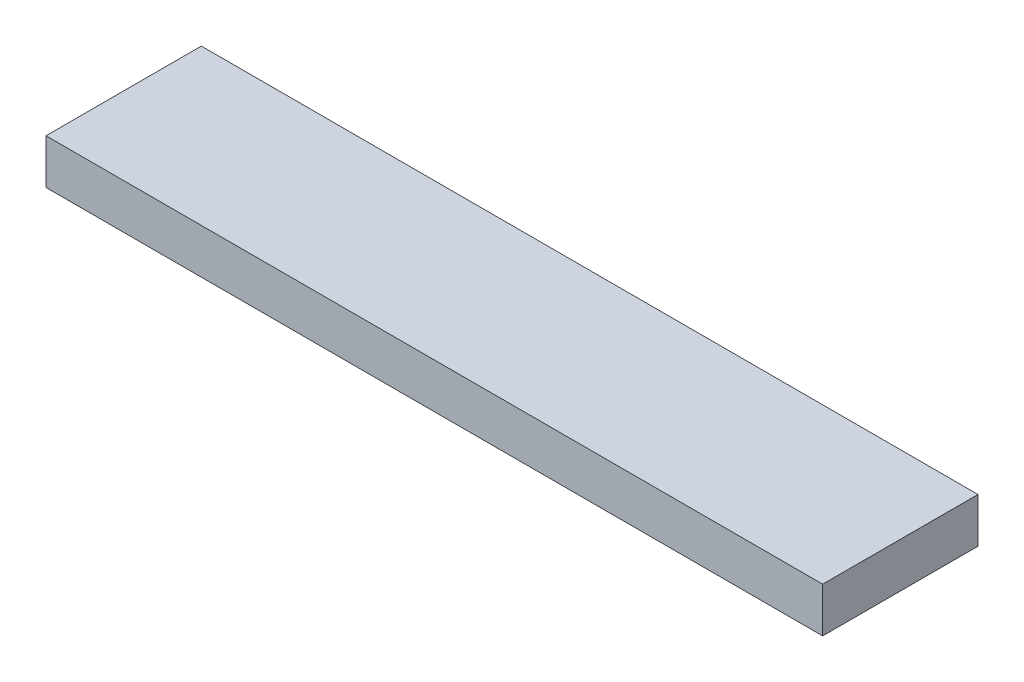
ISO-10303-21;
HEADER;
FILE_DESCRIPTION(('STEP AP214'),'2;1');
FILE_NAME('part.step','',(''),(''),'','','');
FILE_SCHEMA(('AUTOMOTIVE_DESIGN { 1 0 10303 214 1 1 1 1 }'));
ENDSEC;
DATA;
#1=APPLICATION_CONTEXT('core data for automotive mechanical design processes');
#2=APPLICATION_PROTOCOL_DEFINITION('international standard','automotive_design',2000,#1);
#3=PRODUCT_CONTEXT('',#1,'mechanical');
#4=PRODUCT('Part','Part','',(#3));
#5=PRODUCT_RELATED_PRODUCT_CATEGORY('part','',(#4));
#6=PRODUCT_DEFINITION_FORMATION('','',#4);
#7=PRODUCT_DEFINITION_CONTEXT('part definition',#1,'design');
#8=PRODUCT_DEFINITION('design','',#6,#7);
#9=PRODUCT_DEFINITION_SHAPE('','',#8);
#10=(LENGTH_UNIT() NAMED_UNIT(*) SI_UNIT(.MILLI.,.METRE.));
#11=(NAMED_UNIT(*) PLANE_ANGLE_UNIT() SI_UNIT($,.RADIAN.));
#12=(NAMED_UNIT(*) SI_UNIT($,.STERADIAN.) SOLID_ANGLE_UNIT());
#13=UNCERTAINTY_MEASURE_WITH_UNIT(LENGTH_MEASURE(1.E-05),#10,'distance_accuracy_value','');
#14=(GEOMETRIC_REPRESENTATION_CONTEXT(3) GLOBAL_UNCERTAINTY_ASSIGNED_CONTEXT((#13)) GLOBAL_UNIT_ASSIGNED_CONTEXT((#10,
#11,#12)) REPRESENTATION_CONTEXT('',''));
#15=CARTESIAN_POINT('',(0.,0.,0.));
#16=DIRECTION('',(0.,0.,1.));
#17=DIRECTION('',(1.,0.,0.));
#18=AXIS2_PLACEMENT_3D('',#15,#16,#17);
#19=CARTESIAN_POINT('',(-27.5,3.175,5.50000000000001));
#20=DIRECTION('',(1.,0.,0.));
#21=DIRECTION('',(0.,0.,-1.));
#22=AXIS2_PLACEMENT_3D('',#19,#20,#21);
#23=PLANE('',#22);
#24=DIRECTION('',(0.,0.,1.));
#25=VECTOR('',#24,1.);
#26=CARTESIAN_POINT('',(-27.5,0.,5.50000000000001));
#27=LINE('',#26,#25);
#28=CARTESIAN_POINT('',(-27.5,0.,-5.49999999999999));
#29=VERTEX_POINT('',#28);
#30=CARTESIAN_POINT('',(-27.5,0.,5.50000000000001));
#31=VERTEX_POINT('',#30);
#32=EDGE_CURVE('E95',#29,#31,#27,.T.);
#33=ORIENTED_EDGE('',*,*,#32,.T.);
#34=DIRECTION('',(0.,-1.,0.));
#35=VECTOR('',#34,1.);
#36=CARTESIAN_POINT('',(-27.5,3.175,5.50000000000001));
#37=LINE('',#36,#35);
#38=CARTESIAN_POINT('',(-27.5,3.175,5.50000000000001));
#39=VERTEX_POINT('',#38);
#40=EDGE_CURVE('E11',#39,#31,#37,.T.);
#41=ORIENTED_EDGE('',*,*,#40,.F.);
#42=DIRECTION('',(0.,0.,1.));
#43=VECTOR('',#42,1.);
#44=CARTESIAN_POINT('',(-27.5,3.175,5.50000000000001));
#45=LINE('',#44,#43);
#46=CARTESIAN_POINT('',(-27.5,3.175,-5.49999999999999));
#47=VERTEX_POINT('',#46);
#48=EDGE_CURVE('E83',#47,#39,#45,.T.);
#49=ORIENTED_EDGE('',*,*,#48,.F.);
#50=DIRECTION('',(0.,-1.,0.));
#51=VECTOR('',#50,1.);
#52=CARTESIAN_POINT('',(-27.5,3.175,-5.49999999999999));
#53=LINE('',#52,#51);
#54=EDGE_CURVE('E91',#47,#29,#53,.T.);
#55=ORIENTED_EDGE('',*,*,#54,.T.);
#56=EDGE_LOOP('',(#33,#41,#49,#55));
#57=FACE_BOUND('',#56,.T.);
#58=ADVANCED_FACE('F32',(#57),#23,.F.);
#59=CARTESIAN_POINT('',(27.5,3.175,5.5));
#60=DIRECTION('',(0.,0.,-1.));
#61=DIRECTION('',(-1.,0.,0.));
#62=AXIS2_PLACEMENT_3D('',#59,#60,#61);
#63=PLANE('',#62);
#64=DIRECTION('',(1.,0.,0.));
#65=VECTOR('',#64,1.);
#66=CARTESIAN_POINT('',(27.5,0.,5.5));
#67=LINE('',#66,#65);
#68=CARTESIAN_POINT('',(27.5,0.,5.5));
#69=VERTEX_POINT('',#68);
#70=EDGE_CURVE('E87',#31,#69,#67,.T.);
#71=ORIENTED_EDGE('',*,*,#70,.T.);
#72=DIRECTION('',(0.,-1.,0.));
#73=VECTOR('',#72,1.);
#74=CARTESIAN_POINT('',(27.5,3.175,5.5));
#75=LINE('',#74,#73);
#76=CARTESIAN_POINT('',(27.5,3.175,5.5));
#77=VERTEX_POINT('',#76);
#78=EDGE_CURVE('E40',#77,#69,#75,.T.);
#79=ORIENTED_EDGE('',*,*,#78,.F.);
#80=DIRECTION('',(1.,0.,0.));
#81=VECTOR('',#80,1.);
#82=CARTESIAN_POINT('',(27.5,3.175,5.5));
#83=LINE('',#82,#81);
#84=EDGE_CURVE('E78',#39,#77,#83,.T.);
#85=ORIENTED_EDGE('',*,*,#84,.F.);
#86=ORIENTED_EDGE('',*,*,#40,.T.);
#87=EDGE_LOOP('',(#71,#79,#85,#86));
#88=FACE_BOUND('',#87,.T.);
#89=ADVANCED_FACE('F86',(#88),#63,.F.);
#90=CARTESIAN_POINT('',(27.5,3.175,5.5));
#91=DIRECTION('',(-1.,0.,0.));
#92=DIRECTION('',(0.,0.,1.));
#93=AXIS2_PLACEMENT_3D('',#90,#91,#92);
#94=PLANE('',#93);
#95=DIRECTION('',(0.,0.,-1.));
#96=VECTOR('',#95,1.);
#97=CARTESIAN_POINT('',(27.5,0.,5.5));
#98=LINE('',#97,#96);
#99=CARTESIAN_POINT('',(27.5,0.,-5.5));
#100=VERTEX_POINT('',#99);
#101=EDGE_CURVE('E65',#69,#100,#98,.T.);
#102=ORIENTED_EDGE('',*,*,#101,.T.);
#103=DIRECTION('',(0.,-1.,0.));
#104=VECTOR('',#103,1.);
#105=CARTESIAN_POINT('',(27.5,3.175,-5.5));
#106=LINE('',#105,#104);
#107=CARTESIAN_POINT('',(27.5,3.175,-5.5));
#108=VERTEX_POINT('',#107);
#109=EDGE_CURVE('E88',#108,#100,#106,.T.);
#110=ORIENTED_EDGE('',*,*,#109,.F.);
#111=DIRECTION('',(0.,0.,-1.));
#112=VECTOR('',#111,1.);
#113=CARTESIAN_POINT('',(27.5,3.175,5.5));
#114=LINE('',#113,#112);
#115=EDGE_CURVE('E81',#77,#108,#114,.T.);
#116=ORIENTED_EDGE('',*,*,#115,.F.);
#117=ORIENTED_EDGE('',*,*,#78,.T.);
#118=EDGE_LOOP('',(#102,#110,#116,#117));
#119=FACE_BOUND('',#118,.T.);
#120=ADVANCED_FACE('F89',(#119),#94,.F.);
#121=CARTESIAN_POINT('',(27.5,3.175,-5.5));
#122=DIRECTION('',(0.,0.,1.));
#123=DIRECTION('',(1.,0.,0.));
#124=AXIS2_PLACEMENT_3D('',#121,#122,#123);
#125=PLANE('',#124);
#126=DIRECTION('',(-1.,0.,0.));
#127=VECTOR('',#126,1.);
#128=CARTESIAN_POINT('',(27.5,0.,-5.5));
#129=LINE('',#128,#127);
#130=EDGE_CURVE('E71',#100,#29,#129,.T.);
#131=ORIENTED_EDGE('',*,*,#130,.T.);
#132=ORIENTED_EDGE('',*,*,#54,.F.);
#133=DIRECTION('',(-1.,0.,0.));
#134=VECTOR('',#133,1.);
#135=CARTESIAN_POINT('',(27.5,3.175,-5.5));
#136=LINE('',#135,#134);
#137=EDGE_CURVE('E48',#108,#47,#136,.T.);
#138=ORIENTED_EDGE('',*,*,#137,.F.);
#139=ORIENTED_EDGE('',*,*,#109,.T.);
#140=EDGE_LOOP('',(#131,#132,#138,#139));
#141=FACE_BOUND('',#140,.T.);
#142=ADVANCED_FACE('F102',(#141),#125,.F.);
#143=CARTESIAN_POINT('',(0.,3.175,0.));
#144=DIRECTION('',(0.,1.,0.));
#145=DIRECTION('',(0.,0.,1.));
#146=AXIS2_PLACEMENT_3D('',#143,#144,#145);
#147=PLANE('',#146);
#148=ORIENTED_EDGE('',*,*,#48,.T.);
#149=ORIENTED_EDGE('',*,*,#84,.T.);
#150=ORIENTED_EDGE('',*,*,#115,.T.);
#151=ORIENTED_EDGE('',*,*,#137,.T.);
#152=EDGE_LOOP('',(#148,#149,#150,#151));
#153=FACE_BOUND('',#152,.T.);
#154=ADVANCED_FACE('F79',(#153),#147,.T.);
#155=CARTESIAN_POINT('',(0.,0.,0.));
#156=DIRECTION('',(0.,1.,0.));
#157=DIRECTION('',(0.,0.,1.));
#158=AXIS2_PLACEMENT_3D('',#155,#156,#157);
#159=PLANE('',#158);
#160=ORIENTED_EDGE('',*,*,#32,.F.);
#161=ORIENTED_EDGE('',*,*,#130,.F.);
#162=ORIENTED_EDGE('',*,*,#101,.F.);
#163=ORIENTED_EDGE('',*,*,#70,.F.);
#164=EDGE_LOOP('',(#160,#161,#162,#163));
#165=FACE_BOUND('',#164,.T.);
#166=ADVANCED_FACE('F105',(#165),#159,.F.);
#167=CLOSED_SHELL('',(#58,#89,#120,#142,#154,#166));
#168=MANIFOLD_SOLID_BREP('B2',#167);
#169=ADVANCED_BREP_SHAPE_REPRESENTATION('',(#18,#168),#14);
#170=SHAPE_DEFINITION_REPRESENTATION(#9,#169);
ENDSEC;
END-ISO-10303-21;
